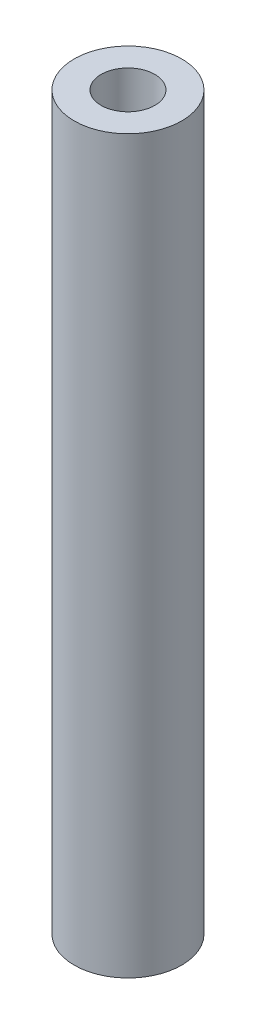
ISO-10303-21;
HEADER;
FILE_DESCRIPTION(('STEP AP214'),'2;1');
FILE_NAME('part.step','',(''),(''),'','','');
FILE_SCHEMA(('AUTOMOTIVE_DESIGN { 1 0 10303 214 1 1 1 1 }'));
ENDSEC;
DATA;
#1=APPLICATION_CONTEXT('core data for automotive mechanical design processes');
#2=APPLICATION_PROTOCOL_DEFINITION('international standard','automotive_design',2000,#1);
#3=PRODUCT_CONTEXT('',#1,'mechanical');
#4=PRODUCT('Part','Part','',(#3));
#5=PRODUCT_RELATED_PRODUCT_CATEGORY('part','',(#4));
#6=PRODUCT_DEFINITION_FORMATION('','',#4);
#7=PRODUCT_DEFINITION_CONTEXT('part definition',#1,'design');
#8=PRODUCT_DEFINITION('design','',#6,#7);
#9=PRODUCT_DEFINITION_SHAPE('','',#8);
#10=(LENGTH_UNIT() NAMED_UNIT(*) SI_UNIT(.MILLI.,.METRE.));
#11=(NAMED_UNIT(*) PLANE_ANGLE_UNIT() SI_UNIT($,.RADIAN.));
#12=(NAMED_UNIT(*) SI_UNIT($,.STERADIAN.) SOLID_ANGLE_UNIT());
#13=UNCERTAINTY_MEASURE_WITH_UNIT(LENGTH_MEASURE(1.E-05),#10,'distance_accuracy_value','');
#14=(GEOMETRIC_REPRESENTATION_CONTEXT(3) GLOBAL_UNCERTAINTY_ASSIGNED_CONTEXT((#13)) GLOBAL_UNIT_ASSIGNED_CONTEXT((#10,
#11,#12)) REPRESENTATION_CONTEXT('',''));
#15=CARTESIAN_POINT('',(0.,0.,0.));
#16=DIRECTION('',(0.,0.,1.));
#17=DIRECTION('',(1.,0.,0.));
#18=AXIS2_PLACEMENT_3D('',#15,#16,#17);
#19=CARTESIAN_POINT('',(0.,34.,0.));
#20=DIRECTION('',(0.,-1.,0.));
#21=DIRECTION('',(0.,0.,-1.));
#22=AXIS2_PLACEMENT_3D('',#19,#20,#21);
#23=CYLINDRICAL_SURFACE('',#22,2.5);
#24=CARTESIAN_POINT('',(0.,34.,0.));
#25=DIRECTION('',(0.,1.,0.));
#26=DIRECTION('',(0.,0.,1.));
#27=AXIS2_PLACEMENT_3D('',#24,#25,#26);
#28=CIRCLE('',#27,2.5);
#29=CARTESIAN_POINT('',(0.,34.,2.5));
#30=VERTEX_POINT('',#29);
#31=EDGE_CURVE('E11',#30,#30,#28,.T.);
#32=ORIENTED_EDGE('',*,*,#31,.F.);
#33=EDGE_LOOP('',(#32));
#34=FACE_BOUND('',#33,.T.);
#35=CARTESIAN_POINT('',(0.,0.,0.));
#36=DIRECTION('',(0.,1.,0.));
#37=DIRECTION('',(0.,0.,1.));
#38=AXIS2_PLACEMENT_3D('',#35,#36,#37);
#39=CIRCLE('',#38,2.5);
#40=CARTESIAN_POINT('',(0.,0.,2.5));
#41=VERTEX_POINT('',#40);
#42=EDGE_CURVE('E36',#41,#41,#39,.T.);
#43=ORIENTED_EDGE('',*,*,#42,.T.);
#44=EDGE_LOOP('',(#43));
#45=FACE_BOUND('',#44,.T.);
#46=ADVANCED_FACE('F33',(#34,#45),#23,.T.);
#47=CARTESIAN_POINT('',(0.,34.,0.));
#48=DIRECTION('',(0.,1.,0.));
#49=DIRECTION('',(0.,0.,1.));
#50=AXIS2_PLACEMENT_3D('',#47,#48,#49);
#51=PLANE('',#50);
#52=CARTESIAN_POINT('',(0.,34.,0.));
#53=DIRECTION('',(0.,1.,0.));
#54=DIRECTION('',(0.,0.,1.));
#55=AXIS2_PLACEMENT_3D('',#52,#53,#54);
#56=CIRCLE('',#55,1.24999999999999);
#57=CARTESIAN_POINT('',(0.,34.,1.24999999999999));
#58=VERTEX_POINT('',#57);
#59=EDGE_CURVE('E56',#58,#58,#56,.T.);
#60=ORIENTED_EDGE('',*,*,#59,.F.);
#61=EDGE_LOOP('',(#60));
#62=FACE_BOUND('',#61,.T.);
#63=ORIENTED_EDGE('',*,*,#31,.T.);
#64=EDGE_LOOP('',(#63));
#65=FACE_BOUND('',#64,.T.);
#66=ADVANCED_FACE('F75',(#62,#65),#51,.T.);
#67=CARTESIAN_POINT('',(0.,0.,0.));
#68=DIRECTION('',(0.,1.,0.));
#69=DIRECTION('',(0.,0.,1.));
#70=AXIS2_PLACEMENT_3D('',#67,#68,#69);
#71=PLANE('',#70);
#72=CARTESIAN_POINT('',(0.,0.,0.));
#73=DIRECTION('',(0.,-1.,0.));
#74=DIRECTION('',(0.,0.,-1.));
#75=AXIS2_PLACEMENT_3D('',#72,#73,#74);
#76=CIRCLE('',#75,1.24999999999999);
#77=CARTESIAN_POINT('',(0.,0.,-1.24999999999999));
#78=VERTEX_POINT('',#77);
#79=EDGE_CURVE('E57',#78,#78,#76,.T.);
#80=ORIENTED_EDGE('',*,*,#79,.F.);
#81=EDGE_LOOP('',(#80));
#82=FACE_BOUND('',#81,.T.);
#83=ORIENTED_EDGE('',*,*,#42,.F.);
#84=EDGE_LOOP('',(#83));
#85=FACE_BOUND('',#84,.T.);
#86=ADVANCED_FACE('F72',(#82,#85),#71,.F.);
#87=CARTESIAN_POINT('',(0.,26.,0.));
#88=DIRECTION('',(0.,1.,0.));
#89=DIRECTION('',(0.,0.,1.));
#90=AXIS2_PLACEMENT_3D('',#87,#88,#89);
#91=CONICAL_SURFACE('',#90,1.25,1.02974425867665);
#92=CARTESIAN_POINT('',(0.,25.2489242262156,0.));
#93=VERTEX_POINT('',#92);
#94=VERTEX_LOOP('',#93);
#95=FACE_BOUND('',#94,.T.);
#96=CARTESIAN_POINT('',(0.,26.,0.));
#97=DIRECTION('',(0.,1.,0.));
#98=DIRECTION('',(0.,0.,1.));
#99=AXIS2_PLACEMENT_3D('',#96,#97,#98);
#100=CIRCLE('',#99,1.25);
#101=CARTESIAN_POINT('',(0.,26.,1.25));
#102=VERTEX_POINT('',#101);
#103=EDGE_CURVE('E60',#102,#102,#100,.T.);
#104=ORIENTED_EDGE('',*,*,#103,.T.);
#105=EDGE_LOOP('',(#104));
#106=FACE_BOUND('',#105,.T.);
#107=ADVANCED_FACE('F74',(#95,#106),#91,.F.);
#108=CARTESIAN_POINT('',(0.,34.,0.));
#109=DIRECTION('',(0.,1.,0.));
#110=DIRECTION('',(0.,0.,1.));
#111=AXIS2_PLACEMENT_3D('',#108,#109,#110);
#112=CYLINDRICAL_SURFACE('',#111,1.24999999999999);
#113=ORIENTED_EDGE('',*,*,#103,.F.);
#114=EDGE_LOOP('',(#113));
#115=FACE_BOUND('',#114,.T.);
#116=ORIENTED_EDGE('',*,*,#59,.T.);
#117=EDGE_LOOP('',(#116));
#118=FACE_BOUND('',#117,.T.);
#119=ADVANCED_FACE('F50',(#115,#118),#112,.F.);
#120=CARTESIAN_POINT('',(0.,7.99999999999999,0.));
#121=DIRECTION('',(0.,-1.,0.));
#122=DIRECTION('',(0.,0.,-1.));
#123=AXIS2_PLACEMENT_3D('',#120,#121,#122);
#124=CONICAL_SURFACE('',#123,1.24999999999999,1.02974425867664);
#125=CARTESIAN_POINT('',(0.,8.75107577378445,0.));
#126=VERTEX_POINT('',#125);
#127=VERTEX_LOOP('',#126);
#128=FACE_BOUND('',#127,.T.);
#129=CARTESIAN_POINT('',(0.,7.99999999999999,0.));
#130=DIRECTION('',(0.,-1.,0.));
#131=DIRECTION('',(0.,0.,-1.));
#132=AXIS2_PLACEMENT_3D('',#129,#130,#131);
#133=CIRCLE('',#132,1.24999999999999);
#134=CARTESIAN_POINT('',(0.,7.99999999999999,-1.24999999999999));
#135=VERTEX_POINT('',#134);
#136=EDGE_CURVE('E54',#135,#135,#133,.T.);
#137=ORIENTED_EDGE('',*,*,#136,.T.);
#138=EDGE_LOOP('',(#137));
#139=FACE_BOUND('',#138,.T.);
#140=ADVANCED_FACE('F46',(#128,#139),#124,.F.);
#141=CARTESIAN_POINT('',(0.,0.,0.));
#142=DIRECTION('',(0.,-1.,0.));
#143=DIRECTION('',(0.,0.,-1.));
#144=AXIS2_PLACEMENT_3D('',#141,#142,#143);
#145=CYLINDRICAL_SURFACE('',#144,1.24999999999999);
#146=ORIENTED_EDGE('',*,*,#136,.F.);
#147=EDGE_LOOP('',(#146));
#148=FACE_BOUND('',#147,.T.);
#149=ORIENTED_EDGE('',*,*,#79,.T.);
#150=EDGE_LOOP('',(#149));
#151=FACE_BOUND('',#150,.T.);
#152=ADVANCED_FACE('F49',(#148,#151),#145,.F.);
#153=CLOSED_SHELL('',(#46,#66,#86,#107,#119,#140,#152));
#154=MANIFOLD_SOLID_BREP('B2',#153);
#155=ADVANCED_BREP_SHAPE_REPRESENTATION('',(#18,#154),#14);
#156=SHAPE_DEFINITION_REPRESENTATION(#9,#155);
ENDSEC;
END-ISO-10303-21;
